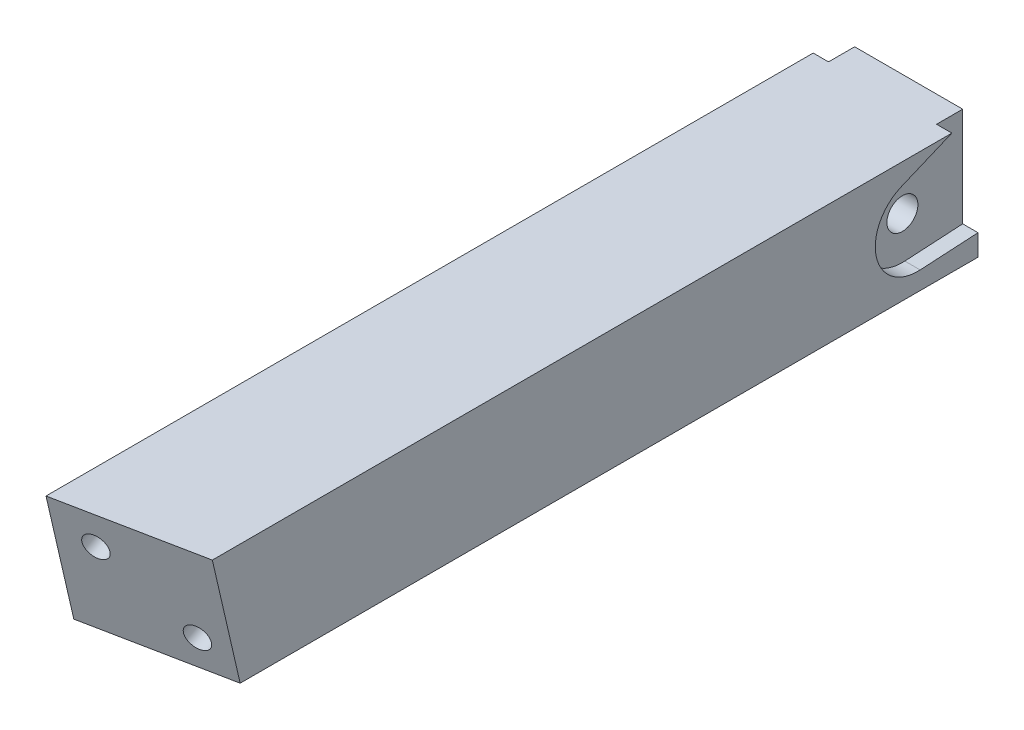
ISO-10303-21;
HEADER;
FILE_DESCRIPTION(('STEP AP214'),'2;1');
FILE_NAME('part.step','',(''),(''),'','','');
FILE_SCHEMA(('AUTOMOTIVE_DESIGN { 1 0 10303 214 1 1 1 1 }'));
ENDSEC;
DATA;
#1=APPLICATION_CONTEXT('core data for automotive mechanical design processes');
#2=APPLICATION_PROTOCOL_DEFINITION('international standard','automotive_design',2000,#1);
#3=PRODUCT_CONTEXT('',#1,'mechanical');
#4=PRODUCT('Part','Part','',(#3));
#5=PRODUCT_RELATED_PRODUCT_CATEGORY('part','',(#4));
#6=PRODUCT_DEFINITION_FORMATION('','',#4);
#7=PRODUCT_DEFINITION_CONTEXT('part definition',#1,'design');
#8=PRODUCT_DEFINITION('design','',#6,#7);
#9=PRODUCT_DEFINITION_SHAPE('','',#8);
#10=(LENGTH_UNIT() NAMED_UNIT(*) SI_UNIT(.MILLI.,.METRE.));
#11=(NAMED_UNIT(*) PLANE_ANGLE_UNIT() SI_UNIT($,.RADIAN.));
#12=(NAMED_UNIT(*) SI_UNIT($,.STERADIAN.) SOLID_ANGLE_UNIT());
#13=UNCERTAINTY_MEASURE_WITH_UNIT(LENGTH_MEASURE(1.E-05),#10,'distance_accuracy_value','');
#14=(GEOMETRIC_REPRESENTATION_CONTEXT(3) GLOBAL_UNCERTAINTY_ASSIGNED_CONTEXT((#13)) GLOBAL_UNIT_ASSIGNED_CONTEXT((#10,
#11,#12)) REPRESENTATION_CONTEXT('',''));
#15=CARTESIAN_POINT('',(0.,0.,0.));
#16=DIRECTION('',(0.,0.,1.));
#17=DIRECTION('',(1.,0.,0.));
#18=AXIS2_PLACEMENT_3D('',#15,#16,#17);
#19=CARTESIAN_POINT('',(0.,0.,-12.7));
#20=DIRECTION('',(0.,0.,1.));
#21=DIRECTION('',(-1.,0.,0.));
#22=AXIS2_PLACEMENT_3D('',#19,#20,#21);
#23=PLANE('',#22);
#24=DIRECTION('',(0.,-1.,0.));
#25=VECTOR('',#24,1.);
#26=CARTESIAN_POINT('',(11.3792,0.,-12.7));
#27=LINE('',#26,#25);
#28=CARTESIAN_POINT('',(11.3792,12.7,-12.7));
#29=VERTEX_POINT('',#28);
#30=CARTESIAN_POINT('',(11.3792,-8.22294016981746,-12.7));
#31=VERTEX_POINT('',#30);
#32=EDGE_CURVE('E237',#29,#31,#27,.T.);
#33=ORIENTED_EDGE('',*,*,#32,.T.);
#34=DIRECTION('',(1.,0.,0.));
#35=VECTOR('',#34,1.);
#36=CARTESIAN_POINT('',(0.,-8.22294016981746,-12.7));
#37=LINE('',#36,#35);
#38=CARTESIAN_POINT('',(14.605,-8.22294016981746,-12.7));
#39=VERTEX_POINT('',#38);
#40=EDGE_CURVE('E234',#31,#39,#37,.T.);
#41=ORIENTED_EDGE('',*,*,#40,.T.);
#42=DIRECTION('',(0.,1.,0.));
#43=VECTOR('',#42,1.);
#44=CARTESIAN_POINT('',(14.605,12.7,-12.7));
#45=LINE('',#44,#43);
#46=CARTESIAN_POINT('',(14.605,-12.7,-12.7));
#47=VERTEX_POINT('',#46);
#48=EDGE_CURVE('E198',#47,#39,#45,.T.);
#49=ORIENTED_EDGE('',*,*,#48,.F.);
#50=DIRECTION('',(1.,0.,0.));
#51=VECTOR('',#50,1.);
#52=CARTESIAN_POINT('',(14.605,-12.7,-12.7));
#53=LINE('',#52,#51);
#54=CARTESIAN_POINT('',(-14.605,-12.7,-12.7));
#55=VERTEX_POINT('',#54);
#56=EDGE_CURVE('E195',#55,#47,#53,.T.);
#57=ORIENTED_EDGE('',*,*,#56,.F.);
#58=DIRECTION('',(0.,-1.,0.));
#59=VECTOR('',#58,1.);
#60=CARTESIAN_POINT('',(-14.605,12.7,-12.7));
#61=LINE('',#60,#59);
#62=CARTESIAN_POINT('',(-14.605,-8.22294016981746,-12.7));
#63=VERTEX_POINT('',#62);
#64=EDGE_CURVE('E185',#63,#55,#61,.T.);
#65=ORIENTED_EDGE('',*,*,#64,.F.);
#66=DIRECTION('',(-1.,0.,0.));
#67=VECTOR('',#66,1.);
#68=CARTESIAN_POINT('',(0.,-8.22294016981746,-12.7));
#69=LINE('',#68,#67);
#70=CARTESIAN_POINT('',(-11.3792,-8.22294016981746,-12.7));
#71=VERTEX_POINT('',#70);
#72=EDGE_CURVE('E225',#71,#63,#69,.T.);
#73=ORIENTED_EDGE('',*,*,#72,.F.);
#74=DIRECTION('',(0.,-1.,0.));
#75=VECTOR('',#74,1.);
#76=CARTESIAN_POINT('',(-11.3792,0.,-12.7));
#77=LINE('',#76,#75);
#78=CARTESIAN_POINT('',(-11.3792,12.7,-12.7));
#79=VERTEX_POINT('',#78);
#80=EDGE_CURVE('E227',#79,#71,#77,.T.);
#81=ORIENTED_EDGE('',*,*,#80,.F.);
#82=DIRECTION('',(-1.,0.,0.));
#83=VECTOR('',#82,1.);
#84=CARTESIAN_POINT('',(14.605,12.7,-12.7));
#85=LINE('',#84,#83);
#86=EDGE_CURVE('E201',#29,#79,#85,.T.);
#87=ORIENTED_EDGE('',*,*,#86,.F.);
#88=EDGE_LOOP('',(#33,#41,#49,#57,#65,#73,#81,#87));
#89=FACE_BOUND('',#88,.T.);
#90=ADVANCED_FACE('F41',(#89),#23,.F.);
#91=CARTESIAN_POINT('',(14.605,12.7,188.165166415459));
#92=DIRECTION('',(0.,1.,0.));
#93=DIRECTION('',(-1.,0.,0.));
#94=AXIS2_PLACEMENT_3D('',#91,#92,#93);
#95=PLANE('',#94);
#96=DIRECTION('',(-1.,0.,0.));
#97=VECTOR('',#96,1.);
#98=CARTESIAN_POINT('',(14.6049999999999,12.7,-7.19305116429456));
#99=LINE('',#98,#97);
#100=CARTESIAN_POINT('',(14.605,12.7,-7.19305116429458));
#101=VERTEX_POINT('',#100);
#102=CARTESIAN_POINT('',(11.3792,12.7,-7.19305116429462));
#103=VERTEX_POINT('',#102);
#104=EDGE_CURVE('E160',#101,#103,#99,.T.);
#105=ORIENTED_EDGE('',*,*,#104,.T.);
#106=DIRECTION('',(0.,0.,1.));
#107=VECTOR('',#106,1.);
#108=CARTESIAN_POINT('',(11.3792,12.7,188.165166415459));
#109=LINE('',#108,#107);
#110=EDGE_CURVE('E145',#29,#103,#109,.T.);
#111=ORIENTED_EDGE('',*,*,#110,.F.);
#112=ORIENTED_EDGE('',*,*,#86,.T.);
#113=DIRECTION('',(0.,0.,1.));
#114=VECTOR('',#113,1.);
#115=CARTESIAN_POINT('',(-11.3792,12.7,188.165166415459));
#116=LINE('',#115,#114);
#117=CARTESIAN_POINT('',(-11.3792,12.7,-7.19305116429462));
#118=VERTEX_POINT('',#117);
#119=EDGE_CURVE('E175',#79,#118,#116,.T.);
#120=ORIENTED_EDGE('',*,*,#119,.T.);
#121=DIRECTION('',(1.,0.,0.));
#122=VECTOR('',#121,1.);
#123=CARTESIAN_POINT('',(14.6049999999999,12.7,-7.19305116429458));
#124=LINE('',#123,#122);
#125=CARTESIAN_POINT('',(-14.605,12.7,-7.19305116429461));
#126=VERTEX_POINT('',#125);
#127=EDGE_CURVE('E178',#126,#118,#124,.T.);
#128=ORIENTED_EDGE('',*,*,#127,.F.);
#129=DIRECTION('',(0.,0.,-1.));
#130=VECTOR('',#129,1.);
#131=CARTESIAN_POINT('',(-14.605,12.7,188.165166415459));
#132=LINE('',#131,#130);
#133=CARTESIAN_POINT('',(-14.605,12.7,154.420740291482));
#134=VERTEX_POINT('',#133);
#135=EDGE_CURVE('E212',#134,#126,#132,.T.);
#136=ORIENTED_EDGE('',*,*,#135,.F.);
#137=DIRECTION('',(-0.980663066608052,0.,0.195703729629488));
#138=VECTOR('',#137,1.);
#139=CARTESIAN_POINT('',(7.01004778863778,12.7,150.107183869919));
#140=LINE('',#139,#138);
#141=CARTESIAN_POINT('',(14.605,12.7,148.59151500797));
#142=VERTEX_POINT('',#141);
#143=EDGE_CURVE('E213',#142,#134,#140,.T.);
#144=ORIENTED_EDGE('',*,*,#143,.F.);
#145=DIRECTION('',(0.,0.,-1.));
#146=VECTOR('',#145,1.);
#147=CARTESIAN_POINT('',(14.605,12.7,188.165166415459));
#148=LINE('',#147,#146);
#149=EDGE_CURVE('E216',#142,#101,#148,.T.);
#150=ORIENTED_EDGE('',*,*,#149,.T.);
#151=EDGE_LOOP('',(#105,#111,#112,#120,#128,#136,#144,#150));
#152=FACE_BOUND('',#151,.T.);
#153=ADVANCED_FACE('F251',(#152),#95,.T.);
#154=CARTESIAN_POINT('',(-14.605,12.7,188.165166415459));
#155=DIRECTION('',(-1.,0.,0.));
#156=DIRECTION('',(0.,-1.,0.));
#157=AXIS2_PLACEMENT_3D('',#154,#155,#156);
#158=PLANE('',#157);
#159=CARTESIAN_POINT('',(-14.605,0.,0.));
#160=DIRECTION('',(1.,0.,0.));
#161=DIRECTION('',(0.,-1.,0.));
#162=AXIS2_PLACEMENT_3D('',#159,#160,#161);
#163=CIRCLE('',#162,8.9408);
#164=CARTESIAN_POINT('',(-14.605,8.24835061759198,3.45001691724403));
#165=VERTEX_POINT('',#164);
#166=CARTESIAN_POINT('',(-14.605,-8.92595629933371,-0.514984254501858));
#167=VERTEX_POINT('',#166);
#168=EDGE_CURVE('E230',#165,#167,#163,.T.);
#169=ORIENTED_EDGE('',*,*,#168,.T.);
#170=DIRECTION('',(0.,0.0575993484365894,-0.998339779363559));
#171=VECTOR('',#170,1.);
#172=CARTESIAN_POINT('',(-14.605,-19.7040188962512,186.295612167765));
#173=LINE('',#172,#171);
#174=EDGE_CURVE('E65',#167,#63,#173,.T.);
#175=ORIENTED_EDGE('',*,*,#174,.T.);
#176=ORIENTED_EDGE('',*,*,#64,.T.);
#177=DIRECTION('',(0.,0.,-1.));
#178=VECTOR('',#177,1.);
#179=CARTESIAN_POINT('',(-14.605,-12.7,188.165166415459));
#180=LINE('',#179,#178);
#181=CARTESIAN_POINT('',(-14.605,-12.7,148.559578361905));
#182=VERTEX_POINT('',#181);
#183=EDGE_CURVE('E211',#182,#55,#180,.T.);
#184=ORIENTED_EDGE('',*,*,#183,.F.);
#185=DIRECTION('',(0.,-0.974394360407053,-0.224845792504398));
#186=VECTOR('',#185,1.);
#187=CARTESIAN_POINT('',(-14.605,20.0930147640101,156.126711026899));
#188=LINE('',#187,#186);
#189=EDGE_CURVE('E208',#134,#182,#188,.T.);
#190=ORIENTED_EDGE('',*,*,#189,.F.);
#191=ORIENTED_EDGE('',*,*,#135,.T.);
#192=DIRECTION('',(0.,0.385873402519241,-0.922551742304042));
#193=VECTOR('',#192,1.);
#194=CARTESIAN_POINT('',(-14.605,-56.8452162857583,159.076663292479));
#195=LINE('',#194,#193);
#196=EDGE_CURVE('E232',#165,#126,#195,.T.);
#197=ORIENTED_EDGE('',*,*,#196,.F.);
#198=EDGE_LOOP('',(#169,#175,#176,#184,#190,#191,#197));
#199=FACE_BOUND('',#198,.T.);
#200=ADVANCED_FACE('F263',(#199),#158,.T.);
#201=CARTESIAN_POINT('',(362.754468767956,1029.79143220821,313.812211097576));
#202=DIRECTION('',(0.190877495960602,-0.220711747589678,0.956479014935362));
#203=DIRECTION('',(0.,0.974394360407053,0.224845792504398));
#204=AXIS2_PLACEMENT_3D('',#201,#202,#203);
#205=PLANE('',#204);
#206=CARTESIAN_POINT('',(-7.21136816746148,5.55874322028748,151.297370988614));
#207=DIRECTION('',(-0.190877495960602,0.220711747589678,-0.956479014935362));
#208=DIRECTION('',(0.,0.974394360407053,0.224845792504398));
#209=AXIS2_PLACEMENT_3D('',#206,#207,#208);
#210=CIRCLE('',#209,2.52730000000013);
#211=CARTESIAN_POINT('',(-7.21136816746148,8.02133008734435,151.86562376001));
#212=VERTEX_POINT('',#211);
#213=EDGE_CURVE('E186',#212,#212,#210,.T.);
#214=ORIENTED_EDGE('',*,*,#213,.T.);
#215=EDGE_LOOP('',(#214));
#216=FACE_BOUND('',#215,.T.);
#217=CARTESIAN_POINT('',(8.37175195215386,-6.13474187750514,145.489238878775));
#218=DIRECTION('',(-0.190877495960602,0.220711747589678,-0.956479014935362));
#219=DIRECTION('',(0.,0.974394360407053,0.224845792504398));
#220=AXIS2_PLACEMENT_3D('',#217,#218,#219);
#221=CIRCLE('',#220,2.52730000000013);
#222=CARTESIAN_POINT('',(8.37175195215386,-3.67215501044826,146.057491650171));
#223=VERTEX_POINT('',#222);
#224=EDGE_CURVE('E189',#223,#223,#221,.T.);
#225=ORIENTED_EDGE('',*,*,#224,.T.);
#226=EDGE_LOOP('',(#225));
#227=FACE_BOUND('',#226,.T.);
#228=ORIENTED_EDGE('',*,*,#189,.T.);
#229=DIRECTION('',(0.980663066608052,0.,-0.195703729629488));
#230=VECTOR('',#229,1.);
#231=CARTESIAN_POINT('',(5.88517699266762,-12.7,144.470504147962));
#232=LINE('',#231,#230);
#233=CARTESIAN_POINT('',(14.605,-12.7,142.730353078394));
#234=VERTEX_POINT('',#233);
#235=EDGE_CURVE('E204',#182,#234,#232,.T.);
#236=ORIENTED_EDGE('',*,*,#235,.T.);
#237=DIRECTION('',(0.,0.974394360407053,0.224845792504398));
#238=VECTOR('',#237,1.);
#239=CARTESIAN_POINT('',(14.605,21.3701308253533,150.59218590238));
#240=LINE('',#239,#238);
#241=EDGE_CURVE('E217',#234,#142,#240,.T.);
#242=ORIENTED_EDGE('',*,*,#241,.T.);
#243=ORIENTED_EDGE('',*,*,#143,.T.);
#244=EDGE_LOOP('',(#228,#236,#242,#243));
#245=FACE_BOUND('',#244,.T.);
#246=ADVANCED_FACE('F43',(#216,#227,#245),#205,.T.);
#247=CARTESIAN_POINT('',(14.605,-12.7,188.165166415459));
#248=DIRECTION('',(0.,-1.,0.));
#249=DIRECTION('',(1.,0.,0.));
#250=AXIS2_PLACEMENT_3D('',#247,#248,#249);
#251=PLANE('',#250);
#252=ORIENTED_EDGE('',*,*,#183,.T.);
#253=ORIENTED_EDGE('',*,*,#56,.T.);
#254=DIRECTION('',(0.,0.,-1.));
#255=VECTOR('',#254,1.);
#256=CARTESIAN_POINT('',(14.605,-12.7,188.165166415459));
#257=LINE('',#256,#255);
#258=EDGE_CURVE('E207',#234,#47,#257,.T.);
#259=ORIENTED_EDGE('',*,*,#258,.F.);
#260=ORIENTED_EDGE('',*,*,#235,.F.);
#261=EDGE_LOOP('',(#252,#253,#259,#260));
#262=FACE_BOUND('',#261,.T.);
#263=ADVANCED_FACE('F260',(#262),#251,.T.);
#264=CARTESIAN_POINT('',(14.605,12.7,188.165166415459));
#265=DIRECTION('',(1.,0.,0.));
#266=DIRECTION('',(0.,1.,0.));
#267=AXIS2_PLACEMENT_3D('',#264,#265,#266);
#268=PLANE('',#267);
#269=DIRECTION('',(0.,0.385873402519241,-0.922551742304042));
#270=VECTOR('',#269,1.);
#271=CARTESIAN_POINT('',(14.605,-56.8452162857583,159.076663292479));
#272=LINE('',#271,#270);
#273=CARTESIAN_POINT('',(14.605,8.24835061759198,3.45001691724403));
#274=VERTEX_POINT('',#273);
#275=EDGE_CURVE('E11',#274,#101,#272,.T.);
#276=ORIENTED_EDGE('',*,*,#275,.T.);
#277=ORIENTED_EDGE('',*,*,#149,.F.);
#278=ORIENTED_EDGE('',*,*,#241,.F.);
#279=ORIENTED_EDGE('',*,*,#258,.T.);
#280=ORIENTED_EDGE('',*,*,#48,.T.);
#281=DIRECTION('',(0.,0.0575993484365893,-0.998339779363559));
#282=VECTOR('',#281,1.);
#283=CARTESIAN_POINT('',(14.605,-19.7040188962512,186.295612167765));
#284=LINE('',#283,#282);
#285=CARTESIAN_POINT('',(14.605,-8.92595629933371,-0.514984254501856));
#286=VERTEX_POINT('',#285);
#287=EDGE_CURVE('E149',#286,#39,#284,.T.);
#288=ORIENTED_EDGE('',*,*,#287,.F.);
#289=CARTESIAN_POINT('',(14.605,0.,0.));
#290=DIRECTION('',(-1.,0.,0.));
#291=DIRECTION('',(0.,1.,0.));
#292=AXIS2_PLACEMENT_3D('',#289,#290,#291);
#293=CIRCLE('',#292,8.9408);
#294=EDGE_CURVE('E50',#274,#286,#293,.F.);
#295=ORIENTED_EDGE('',*,*,#294,.F.);
#296=EDGE_LOOP('',(#276,#277,#278,#279,#280,#288,#295));
#297=FACE_BOUND('',#296,.T.);
#298=ADVANCED_FACE('F242',(#297),#268,.T.);
#299=CARTESIAN_POINT('',(5.34157170377931,-2.63094288451899,130.305134516676));
#300=DIRECTION('',(0.190877495960602,-0.220711747589678,0.956479014935362));
#301=DIRECTION('',(0.,0.974394360407053,0.224845792504398));
#302=AXIS2_PLACEMENT_3D('',#299,#300,#301);
#303=CYLINDRICAL_SURFACE('',#302,2.52730000000013);
#304=CARTESIAN_POINT('',(5.34157170377931,-2.63094288451899,130.305134516676));
#305=DIRECTION('',(-0.190877495960602,0.220711747589678,-0.956479014935362));
#306=DIRECTION('',(0.,0.974394360407053,0.224845792504398));
#307=AXIS2_PLACEMENT_3D('',#304,#305,#306);
#308=CIRCLE('',#307,2.52730000000013);
#309=CARTESIAN_POINT('',(5.34157170377931,-0.168356017462119,130.873387288072));
#310=VERTEX_POINT('',#309);
#311=EDGE_CURVE('E181',#310,#310,#308,.T.);
#312=ORIENTED_EDGE('',*,*,#311,.T.);
#313=EDGE_LOOP('',(#312));
#314=FACE_BOUND('',#313,.T.);
#315=ORIENTED_EDGE('',*,*,#224,.F.);
#316=EDGE_LOOP('',(#315));
#317=FACE_BOUND('',#316,.T.);
#318=ADVANCED_FACE('F300',(#314,#317),#303,.F.);
#319=CARTESIAN_POINT('',(5.34157170377931,-2.63094288451899,130.305134516676));
#320=DIRECTION('',(0.190877495960602,-0.220711747589678,0.956479014935362));
#321=DIRECTION('',(0.,0.974394360407053,0.224845792504398));
#322=AXIS2_PLACEMENT_3D('',#319,#320,#321);
#323=PLANE('',#322);
#324=ORIENTED_EDGE('',*,*,#311,.F.);
#325=EDGE_LOOP('',(#324));
#326=FACE_BOUND('',#325,.T.);
#327=ADVANCED_FACE('F295',(#326),#323,.T.);
#328=CARTESIAN_POINT('',(-10.241548415836,9.06254221327363,136.113266626515));
#329=DIRECTION('',(0.190877495960602,-0.220711747589678,0.956479014935362));
#330=DIRECTION('',(0.,0.974394360407053,0.224845792504398));
#331=AXIS2_PLACEMENT_3D('',#328,#329,#330);
#332=CYLINDRICAL_SURFACE('',#331,2.52730000000013);
#333=CARTESIAN_POINT('',(-10.241548415836,9.06254221327363,136.113266626515));
#334=DIRECTION('',(-0.190877495960602,0.220711747589678,-0.956479014935362));
#335=DIRECTION('',(0.,0.974394360407053,0.224845792504398));
#336=AXIS2_PLACEMENT_3D('',#333,#334,#335);
#337=CIRCLE('',#336,2.52730000000013);
#338=CARTESIAN_POINT('',(-10.241548415836,11.5251290803305,136.681519397911));
#339=VERTEX_POINT('',#338);
#340=EDGE_CURVE('E182',#339,#339,#337,.T.);
#341=ORIENTED_EDGE('',*,*,#340,.T.);
#342=EDGE_LOOP('',(#341));
#343=FACE_BOUND('',#342,.T.);
#344=ORIENTED_EDGE('',*,*,#213,.F.);
#345=EDGE_LOOP('',(#344));
#346=FACE_BOUND('',#345,.T.);
#347=ADVANCED_FACE('F317',(#343,#346),#332,.F.);
#348=CARTESIAN_POINT('',(-10.241548415836,9.06254221327363,136.113266626515));
#349=DIRECTION('',(0.190877495960602,-0.220711747589678,0.956479014935362));
#350=DIRECTION('',(0.,0.974394360407053,0.224845792504398));
#351=AXIS2_PLACEMENT_3D('',#348,#349,#350);
#352=PLANE('',#351);
#353=ORIENTED_EDGE('',*,*,#340,.F.);
#354=EDGE_LOOP('',(#353));
#355=FACE_BOUND('',#354,.T.);
#356=ADVANCED_FACE('F284',(#355),#352,.T.);
#357=CARTESIAN_POINT('',(-14.732,8.24835061759198,3.45001691724403));
#358=DIRECTION('',(0.,-0.922551742304042,-0.385873402519241));
#359=DIRECTION('',(0.,0.385873402519241,-0.922551742304042));
#360=AXIS2_PLACEMENT_3D('',#357,#358,#359);
#361=PLANE('',#360);
#362=ORIENTED_EDGE('',*,*,#196,.T.);
#363=ORIENTED_EDGE('',*,*,#127,.T.);
#364=DIRECTION('',(0.,0.385873402519241,-0.922551742304042));
#365=VECTOR('',#364,1.);
#366=CARTESIAN_POINT('',(-11.3792,8.24835061759198,3.45001691724403));
#367=LINE('',#366,#365);
#368=CARTESIAN_POINT('',(-11.3792,8.24835061759198,3.45001691724403));
#369=VERTEX_POINT('',#368);
#370=EDGE_CURVE('E162',#369,#118,#367,.T.);
#371=ORIENTED_EDGE('',*,*,#370,.F.);
#372=DIRECTION('',(1.,0.,0.));
#373=VECTOR('',#372,1.);
#374=CARTESIAN_POINT('',(-14.732,8.24835061759198,3.45001691724403));
#375=LINE('',#374,#373);
#376=EDGE_CURVE('E164',#165,#369,#375,.T.);
#377=ORIENTED_EDGE('',*,*,#376,.F.);
#378=EDGE_LOOP('',(#362,#363,#371,#377));
#379=FACE_BOUND('',#378,.T.);
#380=ADVANCED_FACE('F267',(#379),#361,.T.);
#381=CARTESIAN_POINT('',(-11.3792,0.,0.));
#382=DIRECTION('',(1.,0.,0.));
#383=DIRECTION('',(0.,-0.224951054343865,0.974370064785235));
#384=AXIS2_PLACEMENT_3D('',#381,#382,#383);
#385=PLANE('',#384);
#386=CARTESIAN_POINT('',(-11.3792,0.,0.));
#387=DIRECTION('',(-1.,0.,0.));
#388=DIRECTION('',(0.,0.,1.));
#389=AXIS2_PLACEMENT_3D('',#386,#387,#388);
#390=CIRCLE('',#389,3.2639);
#391=CARTESIAN_POINT('',(-11.3792,-3.2639,0.));
#392=VERTEX_POINT('',#391);
#393=EDGE_CURVE('E140',#392,#392,#390,.T.);
#394=ORIENTED_EDGE('',*,*,#393,.F.);
#395=EDGE_LOOP('',(#394));
#396=FACE_BOUND('',#395,.T.);
#397=ORIENTED_EDGE('',*,*,#119,.F.);
#398=ORIENTED_EDGE('',*,*,#80,.T.);
#399=DIRECTION('',(0.,0.0575993484365894,-0.998339779363559));
#400=VECTOR('',#399,1.);
#401=CARTESIAN_POINT('',(-11.3792,-8.92595629933371,-0.514984254501858));
#402=LINE('',#401,#400);
#403=CARTESIAN_POINT('',(-11.3792,-8.92595629933371,-0.514984254501858));
#404=VERTEX_POINT('',#403);
#405=EDGE_CURVE('E170',#404,#71,#402,.T.);
#406=ORIENTED_EDGE('',*,*,#405,.F.);
#407=CARTESIAN_POINT('',(-11.3792,0.,0.));
#408=DIRECTION('',(-1.,0.,0.));
#409=DIRECTION('',(0.,0.,1.));
#410=AXIS2_PLACEMENT_3D('',#407,#408,#409);
#411=CIRCLE('',#410,8.9408);
#412=EDGE_CURVE('E167',#369,#404,#411,.F.);
#413=ORIENTED_EDGE('',*,*,#412,.F.);
#414=ORIENTED_EDGE('',*,*,#370,.T.);
#415=EDGE_LOOP('',(#397,#398,#406,#413,#414));
#416=FACE_BOUND('',#415,.T.);
#417=ADVANCED_FACE('F275',(#396,#416),#385,.F.);
#418=CARTESIAN_POINT('',(-14.732,0.,0.));
#419=DIRECTION('',(1.,0.,0.));
#420=DIRECTION('',(0.,-0.224951054343865,0.974370064785235));
#421=AXIS2_PLACEMENT_3D('',#418,#419,#420);
#422=CYLINDRICAL_SURFACE('',#421,8.9408);
#423=ORIENTED_EDGE('',*,*,#168,.F.);
#424=ORIENTED_EDGE('',*,*,#376,.T.);
#425=ORIENTED_EDGE('',*,*,#412,.T.);
#426=DIRECTION('',(-1.,0.,0.));
#427=VECTOR('',#426,1.);
#428=CARTESIAN_POINT('',(-14.732,-8.92595629933371,-0.514984254501858));
#429=LINE('',#428,#427);
#430=EDGE_CURVE('E171',#167,#404,#429,.F.);
#431=ORIENTED_EDGE('',*,*,#430,.F.);
#432=EDGE_LOOP('',(#423,#424,#425,#431));
#433=FACE_BOUND('',#432,.T.);
#434=ADVANCED_FACE('F270',(#433),#422,.F.);
#435=CARTESIAN_POINT('',(-14.732,-8.92595629933371,-0.514984254501858));
#436=DIRECTION('',(0.,-0.998339779363559,-0.0575993484365894));
#437=DIRECTION('',(0.,0.0575993484365893,-0.998339779363559));
#438=AXIS2_PLACEMENT_3D('',#435,#436,#437);
#439=PLANE('',#438);
#440=ORIENTED_EDGE('',*,*,#174,.F.);
#441=ORIENTED_EDGE('',*,*,#430,.T.);
#442=ORIENTED_EDGE('',*,*,#405,.T.);
#443=ORIENTED_EDGE('',*,*,#72,.T.);
#444=EDGE_LOOP('',(#440,#441,#442,#443));
#445=FACE_BOUND('',#444,.T.);
#446=ADVANCED_FACE('F273',(#445),#439,.F.);
#447=CARTESIAN_POINT('',(14.605,8.24835061759198,3.45001691724403));
#448=DIRECTION('',(0.,0.922551742304042,0.385873402519241));
#449=DIRECTION('',(0.,-0.385873402519241,0.922551742304042));
#450=AXIS2_PLACEMENT_3D('',#447,#448,#449);
#451=PLANE('',#450);
#452=ORIENTED_EDGE('',*,*,#104,.F.);
#453=ORIENTED_EDGE('',*,*,#275,.F.);
#454=DIRECTION('',(-1.,0.,0.));
#455=VECTOR('',#454,1.);
#456=CARTESIAN_POINT('',(14.605,8.24835061759198,3.45001691724403));
#457=LINE('',#456,#455);
#458=CARTESIAN_POINT('',(11.3792,8.24835061759198,3.45001691724403));
#459=VERTEX_POINT('',#458);
#460=EDGE_CURVE('E137',#274,#459,#457,.T.);
#461=ORIENTED_EDGE('',*,*,#460,.T.);
#462=DIRECTION('',(0.,0.385873402519241,-0.922551742304042));
#463=VECTOR('',#462,1.);
#464=CARTESIAN_POINT('',(11.3792,8.24835061759197,3.45001691724403));
#465=LINE('',#464,#463);
#466=EDGE_CURVE('E143',#459,#103,#465,.T.);
#467=ORIENTED_EDGE('',*,*,#466,.T.);
#468=EDGE_LOOP('',(#452,#453,#461,#467));
#469=FACE_BOUND('',#468,.T.);
#470=ADVANCED_FACE('F152',(#469),#451,.F.);
#471=CARTESIAN_POINT('',(14.605,0.,0.));
#472=DIRECTION('',(-1.,0.,0.));
#473=DIRECTION('',(0.,0.224951054343865,-0.974370064785235));
#474=AXIS2_PLACEMENT_3D('',#471,#472,#473);
#475=CYLINDRICAL_SURFACE('',#474,8.9408);
#476=ORIENTED_EDGE('',*,*,#460,.F.);
#477=ORIENTED_EDGE('',*,*,#294,.T.);
#478=DIRECTION('',(-1.,0.,0.));
#479=VECTOR('',#478,1.);
#480=CARTESIAN_POINT('',(14.605,-8.92595629933371,-0.514984254501856));
#481=LINE('',#480,#479);
#482=CARTESIAN_POINT('',(11.3792,-8.92595629933371,-0.514984254501856));
#483=VERTEX_POINT('',#482);
#484=EDGE_CURVE('E139',#286,#483,#481,.T.);
#485=ORIENTED_EDGE('',*,*,#484,.T.);
#486=CARTESIAN_POINT('',(11.3792,0.,0.));
#487=DIRECTION('',(-1.,0.,0.));
#488=DIRECTION('',(0.,0.,1.));
#489=AXIS2_PLACEMENT_3D('',#486,#487,#488);
#490=CIRCLE('',#489,8.9408);
#491=EDGE_CURVE('E132',#459,#483,#490,.F.);
#492=ORIENTED_EDGE('',*,*,#491,.F.);
#493=EDGE_LOOP('',(#476,#477,#485,#492));
#494=FACE_BOUND('',#493,.T.);
#495=ADVANCED_FACE('F134',(#494),#475,.F.);
#496=CARTESIAN_POINT('',(11.3792,0.,0.));
#497=DIRECTION('',(1.,0.,0.));
#498=DIRECTION('',(0.,-0.224951054343865,0.974370064785235));
#499=AXIS2_PLACEMENT_3D('',#496,#497,#498);
#500=PLANE('',#499);
#501=CARTESIAN_POINT('',(11.3792,0.,0.));
#502=DIRECTION('',(-1.,0.,0.));
#503=DIRECTION('',(0.,0.,1.));
#504=AXIS2_PLACEMENT_3D('',#501,#502,#503);
#505=CIRCLE('',#504,3.2639);
#506=CARTESIAN_POINT('',(11.3792,-3.2639,0.));
#507=VERTEX_POINT('',#506);
#508=EDGE_CURVE('E45',#507,#507,#505,.T.);
#509=ORIENTED_EDGE('',*,*,#508,.T.);
#510=EDGE_LOOP('',(#509));
#511=FACE_BOUND('',#510,.T.);
#512=ORIENTED_EDGE('',*,*,#32,.F.);
#513=ORIENTED_EDGE('',*,*,#110,.T.);
#514=ORIENTED_EDGE('',*,*,#466,.F.);
#515=ORIENTED_EDGE('',*,*,#491,.T.);
#516=DIRECTION('',(0.,0.0575993484365893,-0.998339779363559));
#517=VECTOR('',#516,1.);
#518=CARTESIAN_POINT('',(11.3792,-8.92595629933371,-0.514984254501858));
#519=LINE('',#518,#517);
#520=EDGE_CURVE('E57',#483,#31,#519,.T.);
#521=ORIENTED_EDGE('',*,*,#520,.T.);
#522=EDGE_LOOP('',(#512,#513,#514,#515,#521));
#523=FACE_BOUND('',#522,.T.);
#524=ADVANCED_FACE('F144',(#511,#523),#500,.T.);
#525=CARTESIAN_POINT('',(14.605,-8.92595629933371,-0.514984254501858));
#526=DIRECTION('',(0.,0.998339779363559,0.0575993484365893));
#527=DIRECTION('',(0.,-0.0575993484365893,0.998339779363559));
#528=AXIS2_PLACEMENT_3D('',#525,#526,#527);
#529=PLANE('',#528);
#530=ORIENTED_EDGE('',*,*,#484,.F.);
#531=ORIENTED_EDGE('',*,*,#287,.T.);
#532=ORIENTED_EDGE('',*,*,#40,.F.);
#533=ORIENTED_EDGE('',*,*,#520,.F.);
#534=EDGE_LOOP('',(#530,#531,#532,#533));
#535=FACE_BOUND('',#534,.T.);
#536=ADVANCED_FACE('F245',(#535),#529,.T.);
#537=CARTESIAN_POINT('',(14.605,0.,0.));
#538=DIRECTION('',(-1.,0.,0.));
#539=DIRECTION('',(0.,-1.,0.));
#540=AXIS2_PLACEMENT_3D('',#537,#538,#539);
#541=CYLINDRICAL_SURFACE('',#540,3.2639);
#542=CARTESIAN_POINT('',(11.3792,-3.2639,0.));
#543=CARTESIAN_POINT('',(11.1421333333333,-3.2639,0.));
#544=CARTESIAN_POINT('',(10.9050666666667,-3.2639,0.));
#545=CARTESIAN_POINT('',(10.4309333333333,-3.2639,0.));
#546=CARTESIAN_POINT('',(10.1938666666667,-3.2639,0.));
#547=CARTESIAN_POINT('',(9.71973333333333,-3.2639,0.));
#548=CARTESIAN_POINT('',(9.48266666666667,-3.2639,0.));
#549=CARTESIAN_POINT('',(9.00853333333333,-3.2639,0.));
#550=CARTESIAN_POINT('',(8.77146666666667,-3.2639,0.));
#551=CARTESIAN_POINT('',(8.29733333333333,-3.2639,0.));
#552=CARTESIAN_POINT('',(8.06026666666667,-3.2639,0.));
#553=CARTESIAN_POINT('',(7.58613333333333,-3.2639,0.));
#554=CARTESIAN_POINT('',(7.34906666666666,-3.2639,0.));
#555=CARTESIAN_POINT('',(6.87493333333333,-3.2639,0.));
#556=CARTESIAN_POINT('',(6.63786666666666,-3.2639,0.));
#557=CARTESIAN_POINT('',(6.16373333333333,-3.2639,0.));
#558=CARTESIAN_POINT('',(5.92666666666666,-3.2639,0.));
#559=CARTESIAN_POINT('',(5.45253333333333,-3.2639,0.));
#560=CARTESIAN_POINT('',(5.21546666666666,-3.2639,0.));
#561=CARTESIAN_POINT('',(4.74133333333333,-3.2639,0.));
#562=CARTESIAN_POINT('',(4.50426666666666,-3.2639,0.));
#563=CARTESIAN_POINT('',(4.03013333333333,-3.2639,0.));
#564=CARTESIAN_POINT('',(3.79306666666666,-3.2639,0.));
#565=CARTESIAN_POINT('',(3.31893333333333,-3.2639,0.));
#566=CARTESIAN_POINT('',(3.08186666666666,-3.2639,0.));
#567=CARTESIAN_POINT('',(2.60773333333333,-3.2639,0.));
#568=CARTESIAN_POINT('',(2.37066666666666,-3.2639,0.));
#569=CARTESIAN_POINT('',(1.89653333333333,-3.2639,0.));
#570=CARTESIAN_POINT('',(1.65946666666666,-3.2639,0.));
#571=CARTESIAN_POINT('',(1.18533333333333,-3.2639,0.));
#572=CARTESIAN_POINT('',(0.948266666666664,-3.2639,0.));
#573=CARTESIAN_POINT('',(0.47413333333333,-3.2639,0.));
#574=CARTESIAN_POINT('',(0.237066666666663,-3.2639,0.));
#575=CARTESIAN_POINT('',(-0.23706666666667,-3.2639,0.));
#576=CARTESIAN_POINT('',(-0.474133333333337,-3.2639,0.));
#577=CARTESIAN_POINT('',(-0.94826666666667,-3.2639,0.));
#578=CARTESIAN_POINT('',(-1.18533333333334,-3.2639,0.));
#579=CARTESIAN_POINT('',(-1.65946666666667,-3.2639,0.));
#580=CARTESIAN_POINT('',(-1.89653333333334,-3.2639,0.));
#581=CARTESIAN_POINT('',(-2.37066666666667,-3.2639,0.));
#582=CARTESIAN_POINT('',(-2.60773333333334,-3.2639,0.));
#583=CARTESIAN_POINT('',(-3.08186666666667,-3.2639,0.));
#584=CARTESIAN_POINT('',(-3.31893333333334,-3.2639,0.));
#585=CARTESIAN_POINT('',(-3.79306666666667,-3.2639,0.));
#586=CARTESIAN_POINT('',(-4.03013333333334,-3.2639,0.));
#587=CARTESIAN_POINT('',(-4.50426666666667,-3.2639,0.));
#588=CARTESIAN_POINT('',(-4.74133333333334,-3.2639,0.));
#589=CARTESIAN_POINT('',(-5.21546666666667,-3.2639,0.));
#590=CARTESIAN_POINT('',(-5.45253333333334,-3.2639,0.));
#591=CARTESIAN_POINT('',(-5.92666666666667,-3.2639,0.));
#592=CARTESIAN_POINT('',(-6.16373333333334,-3.2639,0.));
#593=CARTESIAN_POINT('',(-6.63786666666667,-3.2639,0.));
#594=CARTESIAN_POINT('',(-6.87493333333334,-3.2639,0.));
#595=CARTESIAN_POINT('',(-7.34906666666667,-3.2639,0.));
#596=CARTESIAN_POINT('',(-7.58613333333334,-3.2639,0.));
#597=CARTESIAN_POINT('',(-8.06026666666667,-3.2639,0.));
#598=CARTESIAN_POINT('',(-8.29733333333334,-3.2639,0.));
#599=CARTESIAN_POINT('',(-8.77146666666667,-3.2639,0.));
#600=CARTESIAN_POINT('',(-9.00853333333334,-3.2639,0.));
#601=CARTESIAN_POINT('',(-9.48266666666667,-3.2639,0.));
#602=CARTESIAN_POINT('',(-9.71973333333334,-3.2639,0.));
#603=CARTESIAN_POINT('',(-10.1938666666667,-3.2639,0.));
#604=CARTESIAN_POINT('',(-10.4309333333333,-3.2639,0.));
#605=CARTESIAN_POINT('',(-10.9050666666667,-3.2639,0.));
#606=CARTESIAN_POINT('',(-11.1421333333333,-3.2639,0.));
#607=CARTESIAN_POINT('',(-11.3792,-3.2639,0.));
#608=B_SPLINE_CURVE_WITH_KNOTS('',3,(#542,#543,#544,#545,#546,#547,#548,#549,#550,#551,#552,
#553,#554,#555,#556,#557,#558,#559,#560,#561,#562,#563,#564,#565,#566,#567,#568,#569,#570,#571,
#572,#573,#574,#575,#576,#577,#578,#579,#580,#581,#582,#583,#584,#585,#586,#587,#588,#589,#590,
#591,#592,#593,#594,#595,#596,#597,#598,#599,#600,#601,#602,#603,#604,#605,#606,#607),
.UNSPECIFIED.,.F.,.F.,(4,2,2,2,2,2,2,2,2,2,2,2,2,2,2,2,2,2,2,2,2,2,2,2,2,2,2,2,2,2,2,2,4),(0.,
0.7112,1.4224,2.1336,2.8448,3.556,4.2672,4.9784,5.6896,6.4008,7.112,7.8232,8.5344,9.2456,9.9568,
10.668,11.3792,12.0904,12.8016,13.5128,14.224,14.9352,15.6464,16.3576,17.0688,17.78,18.4912,
19.2024,19.9136,20.6248,21.336,22.0472,22.7584),.UNSPECIFIED.);
#609=EDGE_CURVE('BSEAM336',#507,#392,#608,.T.);
#610=ORIENTED_EDGE('',*,*,#508,.F.);
#611=ORIENTED_EDGE('',*,*,#393,.T.);
#612=ORIENTED_EDGE('',*,*,#609,.T.);
#613=ORIENTED_EDGE('',*,*,#609,.F.);
#614=EDGE_LOOP('',(#610,#612,#611,#613));
#615=FACE_BOUND('',#614,.T.);
#616=ADVANCED_FACE('F336',(#615),#541,.F.);
#617=CLOSED_SHELL('',(#90,#153,#200,#246,#263,#298,#318,#327,#347,#356,#380,#417,#434,#446,#470,
#495,#524,#536,#616));
#618=MANIFOLD_SOLID_BREP('B2',#617);
#619=ADVANCED_BREP_SHAPE_REPRESENTATION('',(#18,#618),#14);
#620=SHAPE_DEFINITION_REPRESENTATION(#9,#619);
ENDSEC;
END-ISO-10303-21;
